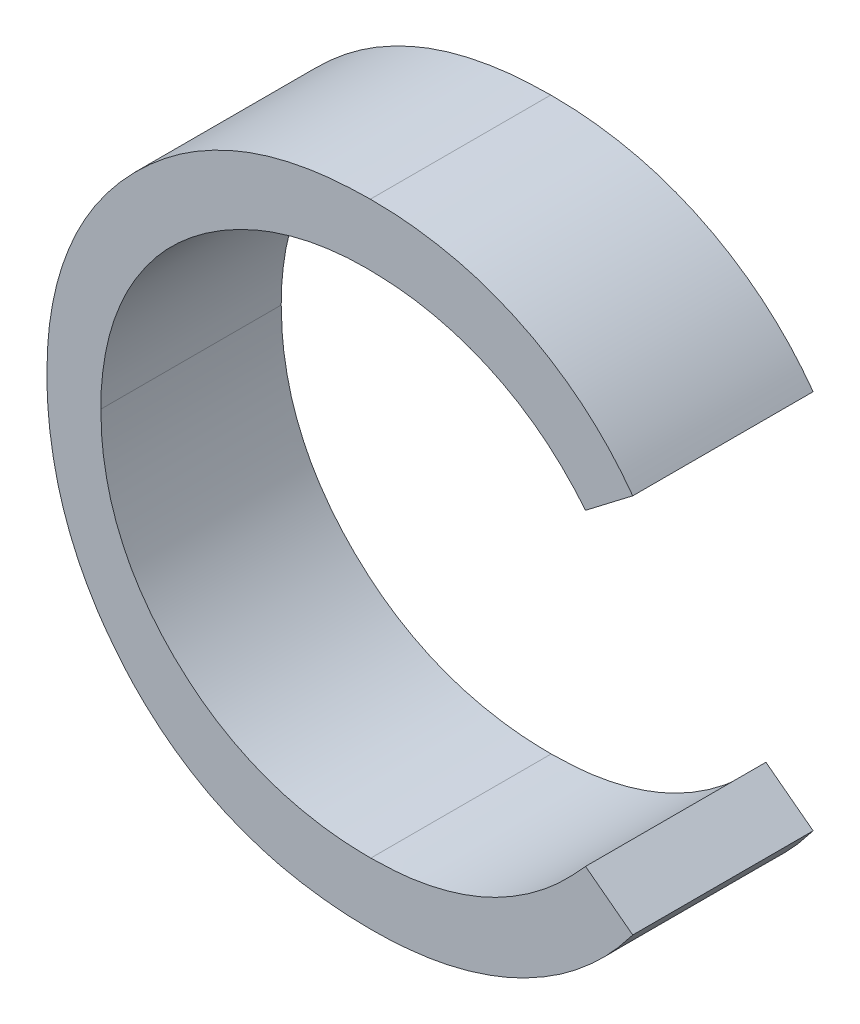
ISO-10303-21;
HEADER;
FILE_DESCRIPTION(('STEP AP214'),'2;1');
FILE_NAME('part.step','',(''),(''),'','','');
FILE_SCHEMA(('AUTOMOTIVE_DESIGN { 1 0 10303 214 1 1 1 1 }'));
ENDSEC;
DATA;
#1=APPLICATION_CONTEXT('core data for automotive mechanical design processes');
#2=APPLICATION_PROTOCOL_DEFINITION('international standard','automotive_design',2000,#1);
#3=PRODUCT_CONTEXT('',#1,'mechanical');
#4=PRODUCT('Part','Part','',(#3));
#5=PRODUCT_RELATED_PRODUCT_CATEGORY('part','',(#4));
#6=PRODUCT_DEFINITION_FORMATION('','',#4);
#7=PRODUCT_DEFINITION_CONTEXT('part definition',#1,'design');
#8=PRODUCT_DEFINITION('design','',#6,#7);
#9=PRODUCT_DEFINITION_SHAPE('','',#8);
#10=(LENGTH_UNIT() NAMED_UNIT(*) SI_UNIT(.MILLI.,.METRE.));
#11=(NAMED_UNIT(*) PLANE_ANGLE_UNIT() SI_UNIT($,.RADIAN.));
#12=(NAMED_UNIT(*) SI_UNIT($,.STERADIAN.) SOLID_ANGLE_UNIT());
#13=UNCERTAINTY_MEASURE_WITH_UNIT(LENGTH_MEASURE(1.E-05),#10,'distance_accuracy_value','');
#14=(GEOMETRIC_REPRESENTATION_CONTEXT(3) GLOBAL_UNCERTAINTY_ASSIGNED_CONTEXT((#13)) GLOBAL_UNIT_ASSIGNED_CONTEXT((#10,
#11,#12)) REPRESENTATION_CONTEXT('',''));
#15=CARTESIAN_POINT('',(0.,0.,0.));
#16=DIRECTION('',(0.,0.,1.));
#17=DIRECTION('',(1.,0.,0.));
#18=AXIS2_PLACEMENT_3D('',#15,#16,#17);
#19=CARTESIAN_POINT('',(-52.9985710951003,-17.7419139480257,1.5));
#20=CARTESIAN_POINT('',(-52.9411218494626,-17.7426027168698,1.5));
#21=CARTESIAN_POINT('',(-52.8274068533271,-17.7439660654321,1.5));
#22=CARTESIAN_POINT('',(-52.6591887784523,-17.7572605541673,1.5));
#23=CARTESIAN_POINT('',(-52.4954140256763,-17.7794228487774,1.5));
#24=CARTESIAN_POINT('',(-52.3359697656272,-17.8095886627962,1.5));
#25=CARTESIAN_POINT('',(-52.1800803139088,-17.847027693467,1.5));
#26=CARTESIAN_POINT('',(-52.0289371126537,-17.895799548205,1.5));
#27=CARTESIAN_POINT('',(-51.8816532742757,-17.951566021513,1.5));
#28=CARTESIAN_POINT('',(-51.7391576911665,-18.0157924014243,1.5));
#29=CARTESIAN_POINT('',(-51.6021340481089,-18.0878877462912,1.5));
#30=CARTESIAN_POINT('',(-51.4706250216642,-18.1670529227859,1.5));
#31=CARTESIAN_POINT('',(-51.3456752235104,-18.2531897877922,1.5));
#32=CARTESIAN_POINT('',(-51.2264054400296,-18.3455657526631,1.5));
#33=CARTESIAN_POINT('',(-51.1148108527781,-18.4461351230852,1.5));
#34=CARTESIAN_POINT('',(-51.0077230262993,-18.5521316887618,1.5));
#35=CARTESIAN_POINT('',(-50.9087786289255,-18.6666085804152,1.5));
#36=CARTESIAN_POINT('',(-50.8477026360768,-18.7471870574279,1.5));
#37=CARTESIAN_POINT('',(-50.8170807104849,-18.7875870249488,1.5));
#38=B_SPLINE_CURVE_WITH_KNOTS('',3,(#19,#20,#21,#22,#23,#24,#25,#26,#27,#28,#29,#30,#31,#32,#33,
#34,#35,#36,#37),.UNSPECIFIED.,.F.,.F.,(4,1,1,1,1,1,1,1,1,1,1,1,1,1,1,1,4),(0.,
0.0685475367089007,0.135682945623048,0.201214989526329,0.265682234754696,0.329266834817258,
0.392395427844327,0.455069761652144,0.517126850064504,0.578790035286652,0.639739863343541,
0.700191503666307,0.75980624259667,0.819628319275009,0.879354791046277,0.939511607764661,1.),.UNSPECIFIED.);
#39=DIRECTION('',(0.,0.,-1.));
#40=VECTOR('',#39,1.);
#41=SURFACE_OF_LINEAR_EXTRUSION('',#38,#40);
#42=CARTESIAN_POINT('',(-52.9985710951003,-17.7419139480257,0.));
#43=CARTESIAN_POINT('',(-52.9411218494626,-17.7426027168698,0.));
#44=CARTESIAN_POINT('',(-52.8274068533271,-17.7439660654321,0.));
#45=CARTESIAN_POINT('',(-52.6591887784523,-17.7572605541673,0.));
#46=CARTESIAN_POINT('',(-52.4954140256763,-17.7794228487774,0.));
#47=CARTESIAN_POINT('',(-52.3359697656272,-17.8095886627962,0.));
#48=CARTESIAN_POINT('',(-52.1800803139088,-17.847027693467,0.));
#49=CARTESIAN_POINT('',(-52.0289371126537,-17.895799548205,0.));
#50=CARTESIAN_POINT('',(-51.8816532742757,-17.951566021513,0.));
#51=CARTESIAN_POINT('',(-51.7391576911665,-18.0157924014243,0.));
#52=CARTESIAN_POINT('',(-51.6021340481089,-18.0878877462912,0.));
#53=CARTESIAN_POINT('',(-51.4706250216642,-18.1670529227859,0.));
#54=CARTESIAN_POINT('',(-51.3456752235104,-18.2531897877922,0.));
#55=CARTESIAN_POINT('',(-51.2264054400296,-18.3455657526631,0.));
#56=CARTESIAN_POINT('',(-51.1148108527781,-18.4461351230852,0.));
#57=CARTESIAN_POINT('',(-51.0077230262993,-18.5521316887618,0.));
#58=CARTESIAN_POINT('',(-50.9087786289255,-18.6666085804152,0.));
#59=CARTESIAN_POINT('',(-50.8477026360768,-18.7471870574279,0.));
#60=CARTESIAN_POINT('',(-50.8170807104849,-18.7875870249488,0.));
#61=B_SPLINE_CURVE_WITH_KNOTS('',3,(#42,#43,#44,#45,#46,#47,#48,#49,#50,#51,#52,#53,#54,#55,#56,
#57,#58,#59,#60),.UNSPECIFIED.,.F.,.F.,(4,1,1,1,1,1,1,1,1,1,1,1,1,1,1,1,4),(0.,
0.0685475367089007,0.135682945623048,0.201214989526329,0.265682234754696,0.329266834817258,
0.392395427844327,0.455069761652144,0.517126850064504,0.578790035286652,0.639739863343541,
0.700191503666307,0.75980624259667,0.819628319275009,0.879354791046277,0.939511607764661,1.),.UNSPECIFIED.);
#62=CARTESIAN_POINT('',(-52.9985710951003,-17.7419139480257,0.));
#63=VERTEX_POINT('',#62);
#64=CARTESIAN_POINT('',(-50.8170807104849,-18.7875870249488,0.));
#65=VERTEX_POINT('',#64);
#66=EDGE_CURVE('E223',#63,#65,#61,.T.);
#67=ORIENTED_EDGE('',*,*,#66,.F.);
#68=DIRECTION('',(0.,0.,-1.));
#69=VECTOR('',#68,1.);
#70=CARTESIAN_POINT('',(-52.9985710951003,-17.7419139480257,1.5));
#71=LINE('',#70,#69);
#72=CARTESIAN_POINT('',(-52.9985710951003,-17.7419139480257,1.5));
#73=VERTEX_POINT('',#72);
#74=EDGE_CURVE('E11',#73,#63,#71,.T.);
#75=ORIENTED_EDGE('',*,*,#74,.F.);
#76=CARTESIAN_POINT('',(-50.8170807104849,-18.7875870249488,1.5));
#77=VERTEX_POINT('',#76);
#78=EDGE_CURVE('E251',#73,#77,#38,.T.);
#79=ORIENTED_EDGE('',*,*,#78,.T.);
#80=DIRECTION('',(0.,0.,-1.));
#81=VECTOR('',#80,1.);
#82=CARTESIAN_POINT('',(-50.8170807104849,-18.7875870249488,1.5));
#83=LINE('',#82,#81);
#84=EDGE_CURVE('E37',#77,#65,#83,.T.);
#85=ORIENTED_EDGE('',*,*,#84,.T.);
#86=EDGE_LOOP('',(#67,#75,#79,#85));
#87=FACE_BOUND('',#86,.T.);
#88=ADVANCED_FACE('F33',(#87),#41,.T.);
#89=CARTESIAN_POINT('',(-55.6888755822798,-20.3410726018718,1.5));
#90=CARTESIAN_POINT('',(-55.6866538771983,-20.25113623967,1.5));
#91=CARTESIAN_POINT('',(-55.6822828111504,-20.0741920617241,1.5));
#92=CARTESIAN_POINT('',(-55.6451459604765,-19.8145149855968,1.5));
#93=CARTESIAN_POINT('',(-55.5854048230601,-19.5657272729493,1.5));
#94=CARTESIAN_POINT('',(-55.5005521250672,-19.3282933521095,1.5));
#95=CARTESIAN_POINT('',(-55.3929730517738,-19.1009643803494,1.5));
#96=CARTESIAN_POINT('',(-55.2600778891459,-18.885476944854,1.5));
#97=CARTESIAN_POINT('',(-55.1034105431153,-18.6804529453447,1.5));
#98=CARTESIAN_POINT('',(-54.9241997321388,-18.4890033006339,1.5));
#99=CARTESIAN_POINT('',(-54.7276749674248,-18.3139470826021,1.5));
#100=CARTESIAN_POINT('',(-54.517219519012,-18.1599382201045,1.5));
#101=CARTESIAN_POINT('',(-54.293245309051,-18.0317703401058,1.5));
#102=CARTESIAN_POINT('',(-54.0582198066573,-17.9246329652114,1.5));
#103=CARTESIAN_POINT('',(-53.810383118705,-17.8422837321602,1.5));
#104=CARTESIAN_POINT('',(-53.5502640199544,-17.784636322606,1.5));
#105=CARTESIAN_POINT('',(-53.2783512845526,-17.7487547279061,1.5));
#106=CARTESIAN_POINT('',(-53.092833533625,-17.7442187166163,1.5));
#107=CARTESIAN_POINT('',(-52.9985710951003,-17.7419139480257,1.5));
#108=B_SPLINE_CURVE_WITH_KNOTS('',3,(#89,#90,#91,#92,#93,#94,#95,#96,#97,#98,#99,#100,#101,#102,
#103,#104,#105,#106,#107),.UNSPECIFIED.,.F.,.F.,(4,1,1,1,1,1,1,1,1,1,1,1,1,1,1,1,4),(0.,
0.0645578459297186,0.127013531549758,0.18795481020209,0.248013912789634,0.307747681848837,
0.368234514697485,0.42946984394267,0.492743436746585,0.556257768706083,0.618216785543143,
0.679655475587554,0.741245545620629,0.803415264705696,0.866815461543992,0.932328311949265,1.),.UNSPECIFIED.);
#109=DIRECTION('',(0.,0.,-1.));
#110=VECTOR('',#109,1.);
#111=SURFACE_OF_LINEAR_EXTRUSION('',#108,#110);
#112=CARTESIAN_POINT('',(-55.6888755822798,-20.3410726018718,0.));
#113=CARTESIAN_POINT('',(-55.6866538771983,-20.25113623967,0.));
#114=CARTESIAN_POINT('',(-55.6822828111504,-20.0741920617241,0.));
#115=CARTESIAN_POINT('',(-55.6451459604765,-19.8145149855968,0.));
#116=CARTESIAN_POINT('',(-55.5854048230601,-19.5657272729493,0.));
#117=CARTESIAN_POINT('',(-55.5005521250672,-19.3282933521095,0.));
#118=CARTESIAN_POINT('',(-55.3929730517738,-19.1009643803494,0.));
#119=CARTESIAN_POINT('',(-55.2600778891459,-18.885476944854,0.));
#120=CARTESIAN_POINT('',(-55.1034105431153,-18.6804529453447,0.));
#121=CARTESIAN_POINT('',(-54.9241997321388,-18.4890033006339,0.));
#122=CARTESIAN_POINT('',(-54.7276749674248,-18.3139470826021,0.));
#123=CARTESIAN_POINT('',(-54.517219519012,-18.1599382201045,0.));
#124=CARTESIAN_POINT('',(-54.293245309051,-18.0317703401058,0.));
#125=CARTESIAN_POINT('',(-54.0582198066573,-17.9246329652114,0.));
#126=CARTESIAN_POINT('',(-53.810383118705,-17.8422837321602,0.));
#127=CARTESIAN_POINT('',(-53.5502640199544,-17.784636322606,0.));
#128=CARTESIAN_POINT('',(-53.2783512845526,-17.7487547279061,0.));
#129=CARTESIAN_POINT('',(-53.092833533625,-17.7442187166163,0.));
#130=CARTESIAN_POINT('',(-52.9985710951003,-17.7419139480257,0.));
#131=B_SPLINE_CURVE_WITH_KNOTS('',3,(#112,#113,#114,#115,#116,#117,#118,#119,#120,#121,#122,
#123,#124,#125,#126,#127,#128,#129,#130),.UNSPECIFIED.,.F.,.F.,(4,1,1,1,1,1,1,1,1,1,1,1,1,1,1,1,
4),(0.,0.0645578459297186,0.127013531549758,0.18795481020209,0.248013912789634,
0.307747681848837,0.368234514697485,0.42946984394267,0.492743436746585,0.556257768706083,
0.618216785543143,0.679655475587554,0.741245545620629,0.803415264705696,0.866815461543992,
0.932328311949265,1.),.UNSPECIFIED.);
#132=CARTESIAN_POINT('',(-55.6888755822798,-20.3410726018718,0.));
#133=VERTEX_POINT('',#132);
#134=EDGE_CURVE('E250',#133,#63,#131,.T.);
#135=ORIENTED_EDGE('',*,*,#134,.F.);
#136=DIRECTION('',(0.,0.,-1.));
#137=VECTOR('',#136,1.);
#138=CARTESIAN_POINT('',(-55.6888755822798,-20.3410726018718,1.5));
#139=LINE('',#138,#137);
#140=CARTESIAN_POINT('',(-55.6888755822798,-20.3410726018718,1.5));
#141=VERTEX_POINT('',#140);
#142=EDGE_CURVE('E43',#141,#133,#139,.T.);
#143=ORIENTED_EDGE('',*,*,#142,.F.);
#144=EDGE_CURVE('E139',#141,#73,#108,.T.);
#145=ORIENTED_EDGE('',*,*,#144,.T.);
#146=ORIENTED_EDGE('',*,*,#74,.T.);
#147=EDGE_LOOP('',(#135,#143,#145,#146));
#148=FACE_BOUND('',#147,.T.);
#149=ADVANCED_FACE('F230',(#148),#111,.T.);
#150=CARTESIAN_POINT('',(-55.0548611592029,-22.1239251659744,1.5));
#151=CARTESIAN_POINT('',(-55.1054835070597,-22.0617234675214,1.5));
#152=CARTESIAN_POINT('',(-55.2061170453851,-21.9380710240812,1.5));
#153=CARTESIAN_POINT('',(-55.3348680218868,-21.7376624794263,1.5));
#154=CARTESIAN_POINT('',(-55.4450788150429,-21.5284221810323,1.5));
#155=CARTESIAN_POINT('',(-55.5341872732974,-21.3092508542061,1.5));
#156=CARTESIAN_POINT('',(-55.6038483206612,-21.0806403010054,1.5));
#157=CARTESIAN_POINT('',(-55.6521071707751,-20.8424752804187,1.5));
#158=CARTESIAN_POINT('',(-55.6834666057434,-20.5949782201299,1.5));
#159=CARTESIAN_POINT('',(-55.6870527325736,-20.4266399506157,1.5));
#160=CARTESIAN_POINT('',(-55.6888755822798,-20.3410726018718,1.5));
#161=B_SPLINE_CURVE_WITH_KNOTS('',3,(#150,#151,#152,#153,#154,#155,#156,#157,#158,#159,#160),
.UNSPECIFIED.,.F.,.F.,(4,1,1,1,1,1,1,1,4),(0.,0.124328509593849,0.247156016361188,
0.368779749291339,0.490733862401648,0.613613771847844,0.738957575722216,0.867310575191261,1.),.UNSPECIFIED.);
#162=DIRECTION('',(0.,0.,-1.));
#163=VECTOR('',#162,1.);
#164=SURFACE_OF_LINEAR_EXTRUSION('',#161,#163);
#165=CARTESIAN_POINT('',(-55.0548611592029,-22.1239251659744,0.));
#166=CARTESIAN_POINT('',(-55.1054835070597,-22.0617234675214,0.));
#167=CARTESIAN_POINT('',(-55.2061170453851,-21.9380710240812,0.));
#168=CARTESIAN_POINT('',(-55.3348680218868,-21.7376624794263,0.));
#169=CARTESIAN_POINT('',(-55.4450788150429,-21.5284221810323,0.));
#170=CARTESIAN_POINT('',(-55.5341872732974,-21.3092508542061,0.));
#171=CARTESIAN_POINT('',(-55.6038483206612,-21.0806403010054,0.));
#172=CARTESIAN_POINT('',(-55.6521071707751,-20.8424752804187,0.));
#173=CARTESIAN_POINT('',(-55.6834666057434,-20.5949782201299,0.));
#174=CARTESIAN_POINT('',(-55.6870527325736,-20.4266399506157,0.));
#175=CARTESIAN_POINT('',(-55.6888755822798,-20.3410726018718,0.));
#176=B_SPLINE_CURVE_WITH_KNOTS('',3,(#165,#166,#167,#168,#169,#170,#171,#172,#173,#174,#175),
.UNSPECIFIED.,.F.,.F.,(4,1,1,1,1,1,1,1,4),(0.,0.124328509593849,0.247156016361188,
0.368779749291339,0.490733862401648,0.613613771847844,0.738957575722216,0.867310575191261,1.),.UNSPECIFIED.);
#177=CARTESIAN_POINT('',(-55.0548611592029,-22.1239251659744,0.));
#178=VERTEX_POINT('',#177);
#179=EDGE_CURVE('E126',#178,#133,#176,.T.);
#180=ORIENTED_EDGE('',*,*,#179,.F.);
#181=DIRECTION('',(0.,0.,-1.));
#182=VECTOR('',#181,1.);
#183=CARTESIAN_POINT('',(-55.0548611592029,-22.1239251659744,1.5));
#184=LINE('',#183,#182);
#185=CARTESIAN_POINT('',(-55.0548611592029,-22.1239251659744,1.5));
#186=VERTEX_POINT('',#185);
#187=EDGE_CURVE('E121',#186,#178,#184,.T.);
#188=ORIENTED_EDGE('',*,*,#187,.F.);
#189=EDGE_CURVE('E124',#186,#141,#161,.T.);
#190=ORIENTED_EDGE('',*,*,#189,.T.);
#191=ORIENTED_EDGE('',*,*,#142,.T.);
#192=EDGE_LOOP('',(#180,#188,#190,#191));
#193=FACE_BOUND('',#192,.T.);
#194=ADVANCED_FACE('F123',(#193),#164,.T.);
#195=CARTESIAN_POINT('',(-52.9925614797157,-22.998324204436,1.5));
#196=CARTESIAN_POINT('',(-53.046338146941,-22.9979499293562,1.5));
#197=CARTESIAN_POINT('',(-53.1526748470792,-22.9972098467336,1.5));
#198=CARTESIAN_POINT('',(-53.309673063668,-22.9852210361465,1.5));
#199=CARTESIAN_POINT('',(-53.462515321956,-22.9688642691322,1.5));
#200=CARTESIAN_POINT('',(-53.6107647874799,-22.9442355104694,1.5));
#201=CARTESIAN_POINT('',(-53.7552304661176,-22.9151721675353,1.5));
#202=CARTESIAN_POINT('',(-53.894602729676,-22.8762132294992,1.5));
#203=CARTESIAN_POINT('',(-54.0302530301881,-22.8325715629333,1.5));
#204=CARTESIAN_POINT('',(-54.1616363740397,-22.7812787247266,1.5));
#205=CARTESIAN_POINT('',(-54.2888645166063,-22.7233984639589,1.5));
#206=CARTESIAN_POINT('',(-54.4115271042747,-22.657981951243,1.5));
#207=CARTESIAN_POINT('',(-54.5295677219875,-22.5855792874412,1.5));
#208=CARTESIAN_POINT('',(-54.6441468946379,-22.5077864154074,1.5));
#209=CARTESIAN_POINT('',(-54.7535720141737,-22.4221045555925,1.5));
#210=CARTESIAN_POINT('',(-54.8587913360985,-22.3297236491587,1.5));
#211=CARTESIAN_POINT('',(-54.9603948735737,-22.230955062371,1.5));
#212=CARTESIAN_POINT('',(-55.0232558521333,-22.1597338433105,1.5));
#213=CARTESIAN_POINT('',(-55.0548611592029,-22.1239251659744,1.5));
#214=B_SPLINE_CURVE_WITH_KNOTS('',3,(#195,#196,#197,#198,#199,#200,#201,#202,#203,#204,#205,
#206,#207,#208,#209,#210,#211,#212,#213),.UNSPECIFIED.,.F.,.F.,(4,1,1,1,1,1,1,1,1,1,1,1,1,1,1,1,
4),(0.,0.0696628008990774,0.137749562258272,0.203916743517782,0.268779862329338,
0.332413706477223,0.394753540447138,0.456180031659169,0.51699564919672,0.577395937965951,
0.637198343509275,0.696999184261453,0.75675619422556,0.816553905272607,0.876947996597871,
0.938131787920596,1.),.UNSPECIFIED.);
#215=DIRECTION('',(0.,0.,-1.));
#216=VECTOR('',#215,1.);
#217=SURFACE_OF_LINEAR_EXTRUSION('',#214,#216);
#218=CARTESIAN_POINT('',(-52.9925614797157,-22.998324204436,0.));
#219=CARTESIAN_POINT('',(-53.046338146941,-22.9979499293562,0.));
#220=CARTESIAN_POINT('',(-53.1526748470792,-22.9972098467336,0.));
#221=CARTESIAN_POINT('',(-53.309673063668,-22.9852210361465,0.));
#222=CARTESIAN_POINT('',(-53.462515321956,-22.9688642691322,0.));
#223=CARTESIAN_POINT('',(-53.6107647874799,-22.9442355104694,0.));
#224=CARTESIAN_POINT('',(-53.7552304661176,-22.9151721675353,0.));
#225=CARTESIAN_POINT('',(-53.894602729676,-22.8762132294992,0.));
#226=CARTESIAN_POINT('',(-54.0302530301881,-22.8325715629333,0.));
#227=CARTESIAN_POINT('',(-54.1616363740397,-22.7812787247266,0.));
#228=CARTESIAN_POINT('',(-54.2888645166063,-22.7233984639589,0.));
#229=CARTESIAN_POINT('',(-54.4115271042747,-22.657981951243,0.));
#230=CARTESIAN_POINT('',(-54.5295677219875,-22.5855792874412,0.));
#231=CARTESIAN_POINT('',(-54.6441468946379,-22.5077864154074,0.));
#232=CARTESIAN_POINT('',(-54.7535720141737,-22.4221045555925,0.));
#233=CARTESIAN_POINT('',(-54.8587913360985,-22.3297236491587,0.));
#234=CARTESIAN_POINT('',(-54.9603948735737,-22.230955062371,0.));
#235=CARTESIAN_POINT('',(-55.0232558521333,-22.1597338433105,0.));
#236=CARTESIAN_POINT('',(-55.0548611592029,-22.1239251659744,0.));
#237=B_SPLINE_CURVE_WITH_KNOTS('',3,(#218,#219,#220,#221,#222,#223,#224,#225,#226,#227,#228,
#229,#230,#231,#232,#233,#234,#235,#236),.UNSPECIFIED.,.F.,.F.,(4,1,1,1,1,1,1,1,1,1,1,1,1,1,1,1,
4),(0.,0.0696628008990774,0.137749562258272,0.203916743517782,0.268779862329338,
0.332413706477223,0.394753540447138,0.456180031659169,0.51699564919672,0.577395937965951,
0.637198343509275,0.696999184261453,0.75675619422556,0.816553905272607,0.876947996597871,
0.938131787920596,1.),.UNSPECIFIED.);
#238=CARTESIAN_POINT('',(-52.9925614797157,-22.998324204436,0.));
#239=VERTEX_POINT('',#238);
#240=EDGE_CURVE('E254',#239,#178,#237,.T.);
#241=ORIENTED_EDGE('',*,*,#240,.F.);
#242=DIRECTION('',(0.,0.,-1.));
#243=VECTOR('',#242,1.);
#244=CARTESIAN_POINT('',(-52.9925614797157,-22.998324204436,1.5));
#245=LINE('',#244,#243);
#246=CARTESIAN_POINT('',(-52.9925614797157,-22.998324204436,1.5));
#247=VERTEX_POINT('',#246);
#248=EDGE_CURVE('E131',#247,#239,#245,.T.);
#249=ORIENTED_EDGE('',*,*,#248,.F.);
#250=EDGE_CURVE('E137',#247,#186,#214,.T.);
#251=ORIENTED_EDGE('',*,*,#250,.T.);
#252=ORIENTED_EDGE('',*,*,#187,.T.);
#253=EDGE_LOOP('',(#241,#249,#251,#252));
#254=FACE_BOUND('',#253,.T.);
#255=ADVANCED_FACE('F141',(#254),#217,.T.);
#256=CARTESIAN_POINT('',(-50.8170807104849,-21.9496463198206,1.5));
#257=CARTESIAN_POINT('',(-50.8486780103151,-21.9904155368539,1.5));
#258=CARTESIAN_POINT('',(-50.9117212606943,-22.0717586886741,1.5));
#259=CARTESIAN_POINT('',(-51.0138041421034,-22.1864325597084,1.5));
#260=CARTESIAN_POINT('',(-51.121343138383,-22.2942954675643,1.5));
#261=CARTESIAN_POINT('',(-51.2351370098214,-22.3944777836036,1.5));
#262=CARTESIAN_POINT('',(-51.3538767120924,-22.4889841630391,1.5));
#263=CARTESIAN_POINT('',(-51.4796943011561,-22.5751296362901,1.5));
#264=CARTESIAN_POINT('',(-51.6109357761637,-22.6541166138363,1.5));
#265=CARTESIAN_POINT('',(-51.7471564603145,-22.7264407917108,1.5));
#266=CARTESIAN_POINT('',(-51.8882116214569,-22.79060828746,1.5));
#267=CARTESIAN_POINT('',(-52.0339322428026,-22.8455422414486,1.5));
#268=CARTESIAN_POINT('',(-52.1836902078083,-22.8928635122094,1.5));
#269=CARTESIAN_POINT('',(-52.3374923626827,-22.9317948503863,1.5));
#270=CARTESIAN_POINT('',(-52.4956577295783,-22.9621821130627,1.5));
#271=CARTESIAN_POINT('',(-52.6576155497115,-22.9824959342695,1.5));
#272=CARTESIAN_POINT('',(-52.8237153714529,-22.9964129548907,1.5));
#273=CARTESIAN_POINT('',(-52.9357745444897,-22.9976814060603,1.5));
#274=CARTESIAN_POINT('',(-52.9925614797157,-22.998324204436,1.5));
#275=B_SPLINE_CURVE_WITH_KNOTS('',3,(#256,#257,#258,#259,#260,#261,#262,#263,#264,#265,#266,
#267,#268,#269,#270,#271,#272,#273,#274),.UNSPECIFIED.,.F.,.F.,(4,1,1,1,1,1,1,1,1,1,1,1,1,1,1,1,
4),(0.,0.0616742388774252,0.123053061634805,0.183475000731703,0.243726500510611,
0.304278916512255,0.364862920960682,0.425946203968619,0.487391229965409,0.549220384075477,
0.611143588692602,0.673528530310151,0.736961456657304,0.800785282872839,0.866012595641614,
0.932100747790579,1.),.UNSPECIFIED.);
#276=DIRECTION('',(0.,0.,-1.));
#277=VECTOR('',#276,1.);
#278=SURFACE_OF_LINEAR_EXTRUSION('',#275,#277);
#279=CARTESIAN_POINT('',(-50.8170807104849,-21.9496463198206,0.));
#280=CARTESIAN_POINT('',(-50.8486780103151,-21.9904155368539,0.));
#281=CARTESIAN_POINT('',(-50.9117212606943,-22.0717586886741,0.));
#282=CARTESIAN_POINT('',(-51.0138041421034,-22.1864325597084,0.));
#283=CARTESIAN_POINT('',(-51.121343138383,-22.2942954675643,0.));
#284=CARTESIAN_POINT('',(-51.2351370098214,-22.3944777836036,0.));
#285=CARTESIAN_POINT('',(-51.3538767120924,-22.4889841630391,0.));
#286=CARTESIAN_POINT('',(-51.4796943011561,-22.5751296362901,0.));
#287=CARTESIAN_POINT('',(-51.6109357761637,-22.6541166138363,0.));
#288=CARTESIAN_POINT('',(-51.7471564603145,-22.7264407917108,0.));
#289=CARTESIAN_POINT('',(-51.8882116214569,-22.79060828746,0.));
#290=CARTESIAN_POINT('',(-52.0339322428026,-22.8455422414486,0.));
#291=CARTESIAN_POINT('',(-52.1836902078083,-22.8928635122094,0.));
#292=CARTESIAN_POINT('',(-52.3374923626827,-22.9317948503863,0.));
#293=CARTESIAN_POINT('',(-52.4956577295783,-22.9621821130627,0.));
#294=CARTESIAN_POINT('',(-52.6576155497115,-22.9824959342695,0.));
#295=CARTESIAN_POINT('',(-52.8237153714529,-22.9964129548907,0.));
#296=CARTESIAN_POINT('',(-52.9357745444897,-22.9976814060603,0.));
#297=CARTESIAN_POINT('',(-52.9925614797157,-22.998324204436,0.));
#298=B_SPLINE_CURVE_WITH_KNOTS('',3,(#279,#280,#281,#282,#283,#284,#285,#286,#287,#288,#289,
#290,#291,#292,#293,#294,#295,#296,#297),.UNSPECIFIED.,.F.,.F.,(4,1,1,1,1,1,1,1,1,1,1,1,1,1,1,1,
4),(0.,0.0616742388774252,0.123053061634805,0.183475000731703,0.243726500510611,
0.304278916512255,0.364862920960682,0.425946203968619,0.487391229965409,0.549220384075477,
0.611143588692602,0.673528530310151,0.736961456657304,0.800785282872839,0.866012595641614,
0.932100747790579,1.),.UNSPECIFIED.);
#299=CARTESIAN_POINT('',(-50.8170807104849,-21.9496463198206,0.));
#300=VERTEX_POINT('',#299);
#301=EDGE_CURVE('E267',#300,#239,#298,.T.);
#302=ORIENTED_EDGE('',*,*,#301,.F.);
#303=DIRECTION('',(0.,0.,-1.));
#304=VECTOR('',#303,1.);
#305=CARTESIAN_POINT('',(-50.8170807104849,-21.9496463198206,1.5));
#306=LINE('',#305,#304);
#307=CARTESIAN_POINT('',(-50.8170807104849,-21.9496463198206,1.5));
#308=VERTEX_POINT('',#307);
#309=EDGE_CURVE('E197',#308,#300,#306,.T.);
#310=ORIENTED_EDGE('',*,*,#309,.F.);
#311=EDGE_CURVE('E142',#308,#247,#275,.T.);
#312=ORIENTED_EDGE('',*,*,#311,.T.);
#313=ORIENTED_EDGE('',*,*,#248,.T.);
#314=EDGE_LOOP('',(#302,#310,#312,#313));
#315=FACE_BOUND('',#314,.T.);
#316=ADVANCED_FACE('F164',(#315),#278,.T.);
#317=CARTESIAN_POINT('',(-51.2097089156131,-21.6521703582821,1.5));
#318=DIRECTION('',(0.603896835253378,0.797062489627353,0.));
#319=DIRECTION('',(-0.797062489627353,0.603896835253378,0.));
#320=AXIS2_PLACEMENT_3D('',#317,#318,#319);
#321=PLANE('',#320);
#322=DIRECTION('',(0.797062489627353,-0.603896835253378,0.));
#323=VECTOR('',#322,1.);
#324=CARTESIAN_POINT('',(-51.2097089156131,-21.6521703582821,0.));
#325=LINE('',#324,#323);
#326=CARTESIAN_POINT('',(-51.2097089156131,-21.6521703582821,0.));
#327=VERTEX_POINT('',#326);
#328=EDGE_CURVE('E269',#327,#300,#325,.T.);
#329=ORIENTED_EDGE('',*,*,#328,.F.);
#330=DIRECTION('',(0.,0.,-1.));
#331=VECTOR('',#330,1.);
#332=CARTESIAN_POINT('',(-51.2097089156131,-21.6521703582821,1.5));
#333=LINE('',#332,#331);
#334=CARTESIAN_POINT('',(-51.2097089156131,-21.6521703582821,1.5));
#335=VERTEX_POINT('',#334);
#336=EDGE_CURVE('E199',#335,#327,#333,.T.);
#337=ORIENTED_EDGE('',*,*,#336,.F.);
#338=DIRECTION('',(0.797062489627353,-0.603896835253378,0.));
#339=VECTOR('',#338,1.);
#340=CARTESIAN_POINT('',(-51.2097089156131,-21.6521703582821,1.5));
#341=LINE('',#340,#339);
#342=EDGE_CURVE('E144',#335,#308,#341,.T.);
#343=ORIENTED_EDGE('',*,*,#342,.T.);
#344=ORIENTED_EDGE('',*,*,#309,.T.);
#345=EDGE_LOOP('',(#329,#337,#343,#344));
#346=FACE_BOUND('',#345,.T.);
#347=ADVANCED_FACE('F168',(#346),#321,.T.);
#348=CARTESIAN_POINT('',(-52.995566287408,-22.4855036916154,1.5));
#349=CARTESIAN_POINT('',(-52.9082767317029,-22.4830911491141,1.5));
#350=CARTESIAN_POINT('',(-52.7364700046744,-22.4783426883434,1.5));
#351=CARTESIAN_POINT('',(-52.4845156813297,-22.4381151895964,1.5));
#352=CARTESIAN_POINT('',(-52.2433217304314,-22.3728895926892,1.5));
#353=CARTESIAN_POINT('',(-52.0128751782294,-22.281606846519,1.5));
#354=CARTESIAN_POINT('',(-51.7938256836511,-22.1629421495151,1.5));
#355=CARTESIAN_POINT('',(-51.5858304546382,-22.0190880389331,1.5));
#356=CARTESIAN_POINT('',(-51.3887139253468,-21.8486761349893,1.5));
#357=CARTESIAN_POINT('',(-51.270183522152,-21.7185573803362,1.5));
#358=CARTESIAN_POINT('',(-51.2097089156131,-21.6521703582821,1.5));
#359=B_SPLINE_CURVE_WITH_KNOTS('',3,(#348,#349,#350,#351,#352,#353,#354,#355,#356,#357,#358),
.UNSPECIFIED.,.F.,.F.,(4,1,1,1,1,1,1,1,4),(0.,0.128515189511661,0.252948636352657,
0.374754734006006,0.495939753867051,0.617180641429892,0.740909469278138,0.867811148186202,1.),.UNSPECIFIED.);
#360=DIRECTION('',(0.,0.,-1.));
#361=VECTOR('',#360,1.);
#362=SURFACE_OF_LINEAR_EXTRUSION('',#359,#361);
#363=CARTESIAN_POINT('',(-52.995566287408,-22.4855036916154,0.));
#364=CARTESIAN_POINT('',(-52.9082767317029,-22.4830911491141,0.));
#365=CARTESIAN_POINT('',(-52.7364700046744,-22.4783426883434,0.));
#366=CARTESIAN_POINT('',(-52.4845156813297,-22.4381151895964,0.));
#367=CARTESIAN_POINT('',(-52.2433217304314,-22.3728895926892,0.));
#368=CARTESIAN_POINT('',(-52.0128751782294,-22.281606846519,0.));
#369=CARTESIAN_POINT('',(-51.7938256836511,-22.1629421495151,0.));
#370=CARTESIAN_POINT('',(-51.5858304546382,-22.0190880389331,0.));
#371=CARTESIAN_POINT('',(-51.3887139253468,-21.8486761349893,0.));
#372=CARTESIAN_POINT('',(-51.270183522152,-21.7185573803362,0.));
#373=CARTESIAN_POINT('',(-51.2097089156131,-21.6521703582821,0.));
#374=B_SPLINE_CURVE_WITH_KNOTS('',3,(#363,#364,#365,#366,#367,#368,#369,#370,#371,#372,#373),
.UNSPECIFIED.,.F.,.F.,(4,1,1,1,1,1,1,1,4),(0.,0.128515189511661,0.252948636352657,
0.374754734006006,0.495939753867051,0.617180641429892,0.740909469278138,0.867811148186202,1.),.UNSPECIFIED.);
#375=CARTESIAN_POINT('',(-52.995566287408,-22.4855036916154,0.));
#376=VERTEX_POINT('',#375);
#377=EDGE_CURVE('E206',#376,#327,#374,.T.);
#378=ORIENTED_EDGE('',*,*,#377,.F.);
#379=DIRECTION('',(0.,0.,-1.));
#380=VECTOR('',#379,1.);
#381=CARTESIAN_POINT('',(-52.995566287408,-22.4855036916154,1.5));
#382=LINE('',#381,#380);
#383=CARTESIAN_POINT('',(-52.995566287408,-22.4855036916154,1.5));
#384=VERTEX_POINT('',#383);
#385=EDGE_CURVE('E204',#384,#376,#382,.T.);
#386=ORIENTED_EDGE('',*,*,#385,.F.);
#387=EDGE_CURVE('E181',#384,#335,#359,.T.);
#388=ORIENTED_EDGE('',*,*,#387,.T.);
#389=ORIENTED_EDGE('',*,*,#336,.T.);
#390=EDGE_LOOP('',(#378,#386,#388,#389));
#391=FACE_BOUND('',#390,.T.);
#392=ADVANCED_FACE('F172',(#391),#362,.T.);
#393=CARTESIAN_POINT('',(-55.2401576335619,-20.3751270890513,1.5));
#394=CARTESIAN_POINT('',(-55.2383550349563,-20.4490289746552,1.5));
#395=CARTESIAN_POINT('',(-55.234815871697,-20.5941255244401,1.5));
#396=CARTESIAN_POINT('',(-55.2033182515821,-20.8066549680705,1.5));
#397=CARTESIAN_POINT('',(-55.1554538354555,-21.0102559306137,1.5));
#398=CARTESIAN_POINT('',(-55.0837172969759,-21.2036557053436,1.5));
#399=CARTESIAN_POINT('',(-54.9952615104609,-21.3892390739979,1.5));
#400=CARTESIAN_POINT('',(-54.8834892083105,-21.5638660074356,1.5));
#401=CARTESIAN_POINT('',(-54.7540370120759,-21.7301753853093,1.5));
#402=CARTESIAN_POINT('',(-54.6050735557029,-21.8842367392356,1.5));
#403=CARTESIAN_POINT('',(-54.4416366757183,-22.0249706325186,1.5));
#404=CARTESIAN_POINT('',(-54.2662825162984,-22.1489000346776,1.5));
#405=CARTESIAN_POINT('',(-54.0794478194639,-22.2522070096296,1.5));
#406=CARTESIAN_POINT('',(-53.8831954906259,-22.3381726475101,1.5));
#407=CARTESIAN_POINT('',(-53.6760153278851,-22.404253687018,1.5));
#408=CARTESIAN_POINT('',(-53.4582798958653,-22.4507738634512,1.5));
#409=CARTESIAN_POINT('',(-53.2304627597937,-22.4811198356535,1.5));
#410=CARTESIAN_POINT('',(-53.0747921885223,-22.4840251043237,1.5));
#411=CARTESIAN_POINT('',(-52.995566287408,-22.4855036916154,1.5));
#412=B_SPLINE_CURVE_WITH_KNOTS('',3,(#393,#394,#395,#396,#397,#398,#399,#400,#401,#402,#403,
#404,#405,#406,#407,#408,#409,#410,#411),.UNSPECIFIED.,.F.,.F.,(4,1,1,1,1,1,1,1,1,1,1,1,1,1,1,1,
4),(0.,0.0643232165798421,0.126290103703556,0.186726469216133,0.246146432335344,
0.30557564264614,0.365429385618053,0.42632630894826,0.488839906400641,0.551724971814048,
0.613918596466159,0.675483765768397,0.737333897099285,0.800229044394527,0.864502298123322,
0.931040739155698,1.),.UNSPECIFIED.);
#413=DIRECTION('',(0.,0.,-1.));
#414=VECTOR('',#413,1.);
#415=SURFACE_OF_LINEAR_EXTRUSION('',#412,#414);
#416=CARTESIAN_POINT('',(-55.2401576335619,-20.3751270890513,0.));
#417=CARTESIAN_POINT('',(-55.2383550349563,-20.4490289746552,0.));
#418=CARTESIAN_POINT('',(-55.234815871697,-20.5941255244401,0.));
#419=CARTESIAN_POINT('',(-55.2033182515821,-20.8066549680705,0.));
#420=CARTESIAN_POINT('',(-55.1554538354555,-21.0102559306137,0.));
#421=CARTESIAN_POINT('',(-55.0837172969759,-21.2036557053436,0.));
#422=CARTESIAN_POINT('',(-54.9952615104609,-21.3892390739979,0.));
#423=CARTESIAN_POINT('',(-54.8834892083105,-21.5638660074356,0.));
#424=CARTESIAN_POINT('',(-54.7540370120759,-21.7301753853093,0.));
#425=CARTESIAN_POINT('',(-54.6050735557029,-21.8842367392356,0.));
#426=CARTESIAN_POINT('',(-54.4416366757183,-22.0249706325186,0.));
#427=CARTESIAN_POINT('',(-54.2662825162984,-22.1489000346776,0.));
#428=CARTESIAN_POINT('',(-54.0794478194639,-22.2522070096296,0.));
#429=CARTESIAN_POINT('',(-53.8831954906259,-22.3381726475101,0.));
#430=CARTESIAN_POINT('',(-53.6760153278851,-22.404253687018,0.));
#431=CARTESIAN_POINT('',(-53.4582798958653,-22.4507738634512,0.));
#432=CARTESIAN_POINT('',(-53.2304627597937,-22.4811198356535,0.));
#433=CARTESIAN_POINT('',(-53.0747921885223,-22.4840251043237,0.));
#434=CARTESIAN_POINT('',(-52.995566287408,-22.4855036916154,0.));
#435=B_SPLINE_CURVE_WITH_KNOTS('',3,(#416,#417,#418,#419,#420,#421,#422,#423,#424,#425,#426,
#427,#428,#429,#430,#431,#432,#433,#434),.UNSPECIFIED.,.F.,.F.,(4,1,1,1,1,1,1,1,1,1,1,1,1,1,1,1,
4),(0.,0.0643232165798421,0.126290103703556,0.186726469216133,0.246146432335344,
0.30557564264614,0.365429385618053,0.42632630894826,0.488839906400641,0.551724971814048,
0.613918596466159,0.675483765768397,0.737333897099285,0.800229044394527,0.864502298123322,
0.931040739155698,1.),.UNSPECIFIED.);
#436=CARTESIAN_POINT('',(-55.2401576335619,-20.3751270890513,0.));
#437=VERTEX_POINT('',#436);
#438=EDGE_CURVE('E286',#437,#376,#435,.T.);
#439=ORIENTED_EDGE('',*,*,#438,.F.);
#440=DIRECTION('',(0.,0.,-1.));
#441=VECTOR('',#440,1.);
#442=CARTESIAN_POINT('',(-55.2401576335619,-20.3751270890513,1.5));
#443=LINE('',#442,#441);
#444=CARTESIAN_POINT('',(-55.2401576335619,-20.3751270890513,1.5));
#445=VERTEX_POINT('',#444);
#446=EDGE_CURVE('E210',#445,#437,#443,.T.);
#447=ORIENTED_EDGE('',*,*,#446,.F.);
#448=EDGE_CURVE('E186',#445,#384,#412,.T.);
#449=ORIENTED_EDGE('',*,*,#448,.T.);
#450=ORIENTED_EDGE('',*,*,#385,.T.);
#451=EDGE_LOOP('',(#439,#447,#449,#450));
#452=FACE_BOUND('',#451,.T.);
#453=ADVANCED_FACE('F177',(#452),#415,.T.);
#454=CARTESIAN_POINT('',(-53.0266159668952,-18.2547344608462,1.5));
#455=CARTESIAN_POINT('',(-53.0767349659529,-18.255311550146,1.5));
#456=CARTESIAN_POINT('',(-53.1765078124828,-18.2564603728125,1.5));
#457=CARTESIAN_POINT('',(-53.3245770603406,-18.2716162659624,1.5));
#458=CARTESIAN_POINT('',(-53.4698814190997,-18.2929179945975,1.5));
#459=CARTESIAN_POINT('',(-53.6123263708406,-18.3245255992024,1.5));
#460=CARTESIAN_POINT('',(-53.7517305973252,-18.3644864835988,1.5));
#461=CARTESIAN_POINT('',(-53.889005457419,-18.4122370749184,1.5));
#462=CARTESIAN_POINT('',(-54.0221634571292,-18.4713154175755,1.5));
#463=CARTESIAN_POINT('',(-54.1530466545781,-18.5366129317996,1.5));
#464=CARTESIAN_POINT('',(-54.2784455274285,-18.6103664242901,1.5));
#465=CARTESIAN_POINT('',(-54.3970955956818,-18.6908140698351,1.5));
#466=CARTESIAN_POINT('',(-54.5085641212835,-18.7770556361776,1.5));
#467=CARTESIAN_POINT('',(-54.6129392814738,-18.8694143595745,1.5));
#468=CARTESIAN_POINT('',(-54.7103277790959,-18.967474303111,1.5));
#469=CARTESIAN_POINT('',(-54.800023937389,-19.0722805053811,1.5));
#470=CARTESIAN_POINT('',(-54.8817173806253,-19.18349789612,1.5));
#471=CARTESIAN_POINT('',(-54.9570274164302,-19.2996599069177,1.5));
#472=CARTESIAN_POINT('',(-55.0244741783655,-19.4204281806818,1.5));
#473=CARTESIAN_POINT('',(-55.0809454346382,-19.5462497098796,1.5));
#474=CARTESIAN_POINT('',(-55.1309527520748,-19.6749698570669,1.5));
#475=CARTESIAN_POINT('',(-55.170523098712,-19.808042943965,1.5));
#476=CARTESIAN_POINT('',(-55.2018438370425,-19.9445326094554,1.5));
#477=CARTESIAN_POINT('',(-55.2234547845761,-20.0848051636696,1.5));
#478=CARTESIAN_POINT('',(-55.2384383148536,-20.2285675630943,1.5));
#479=CARTESIAN_POINT('',(-55.2395814247118,-20.3260094382577,1.5));
#480=CARTESIAN_POINT('',(-55.2401576335619,-20.3751270890513,1.5));
#481=B_SPLINE_CURVE_WITH_KNOTS('',3,(#454,#455,#456,#457,#458,#459,#460,#461,#462,#463,#464,
#465,#466,#467,#468,#469,#470,#471,#472,#473,#474,#475,#476,#477,#478,#479,#480),.UNSPECIFIED.,
.F.,.F.,(4,1,1,1,1,1,1,1,1,1,1,1,1,1,1,1,1,1,1,1,1,1,1,1,4),(0.,0.0439549089061942,
0.0875018747976039,0.130462626731491,0.172752020566518,0.215403067379603,0.257649829743239,
0.300152748957294,0.343121489502086,0.385925163206432,0.427685727402802,0.468817950486588,
0.509491800154994,0.549883031073349,0.589980022966886,0.63040523000684,0.670868626082638,
0.711383943838175,0.751627258063584,0.791775576865192,0.832458918803742,0.873319045017288,
0.914542955626349,0.956923558209884,1.),.UNSPECIFIED.);
#482=DIRECTION('',(0.,0.,-1.));
#483=VECTOR('',#482,1.);
#484=SURFACE_OF_LINEAR_EXTRUSION('',#481,#483);
#485=CARTESIAN_POINT('',(-53.0266159668952,-18.2547344608462,0.));
#486=CARTESIAN_POINT('',(-53.0767349659529,-18.255311550146,0.));
#487=CARTESIAN_POINT('',(-53.1765078124828,-18.2564603728125,0.));
#488=CARTESIAN_POINT('',(-53.3245770603406,-18.2716162659624,0.));
#489=CARTESIAN_POINT('',(-53.4698814190997,-18.2929179945975,0.));
#490=CARTESIAN_POINT('',(-53.6123263708406,-18.3245255992024,0.));
#491=CARTESIAN_POINT('',(-53.7517305973252,-18.3644864835988,0.));
#492=CARTESIAN_POINT('',(-53.889005457419,-18.4122370749184,0.));
#493=CARTESIAN_POINT('',(-54.0221634571292,-18.4713154175755,0.));
#494=CARTESIAN_POINT('',(-54.1530466545781,-18.5366129317996,0.));
#495=CARTESIAN_POINT('',(-54.2784455274285,-18.6103664242901,0.));
#496=CARTESIAN_POINT('',(-54.3970955956818,-18.6908140698351,0.));
#497=CARTESIAN_POINT('',(-54.5085641212835,-18.7770556361776,0.));
#498=CARTESIAN_POINT('',(-54.6129392814738,-18.8694143595745,0.));
#499=CARTESIAN_POINT('',(-54.7103277790959,-18.967474303111,0.));
#500=CARTESIAN_POINT('',(-54.800023937389,-19.0722805053811,0.));
#501=CARTESIAN_POINT('',(-54.8817173806253,-19.18349789612,0.));
#502=CARTESIAN_POINT('',(-54.9570274164302,-19.2996599069177,0.));
#503=CARTESIAN_POINT('',(-55.0244741783655,-19.4204281806818,0.));
#504=CARTESIAN_POINT('',(-55.0809454346382,-19.5462497098796,0.));
#505=CARTESIAN_POINT('',(-55.1309527520748,-19.6749698570669,0.));
#506=CARTESIAN_POINT('',(-55.170523098712,-19.808042943965,0.));
#507=CARTESIAN_POINT('',(-55.2018438370425,-19.9445326094554,0.));
#508=CARTESIAN_POINT('',(-55.2234547845761,-20.0848051636696,0.));
#509=CARTESIAN_POINT('',(-55.2384383148536,-20.2285675630943,0.));
#510=CARTESIAN_POINT('',(-55.2395814247118,-20.3260094382577,0.));
#511=CARTESIAN_POINT('',(-55.2401576335619,-20.3751270890513,0.));
#512=B_SPLINE_CURVE_WITH_KNOTS('',3,(#485,#486,#487,#488,#489,#490,#491,#492,#493,#494,#495,
#496,#497,#498,#499,#500,#501,#502,#503,#504,#505,#506,#507,#508,#509,#510,#511),.UNSPECIFIED.,
.F.,.F.,(4,1,1,1,1,1,1,1,1,1,1,1,1,1,1,1,1,1,1,1,1,1,1,1,4),(0.,0.0439549089061942,
0.0875018747976039,0.130462626731491,0.172752020566518,0.215403067379603,0.257649829743239,
0.300152748957294,0.343121489502086,0.385925163206432,0.427685727402802,0.468817950486588,
0.509491800154994,0.549883031073349,0.589980022966886,0.63040523000684,0.670868626082638,
0.711383943838175,0.751627258063584,0.791775576865192,0.832458918803742,0.873319045017288,
0.914542955626349,0.956923558209884,1.),.UNSPECIFIED.);
#513=CARTESIAN_POINT('',(-53.0266159668952,-18.2547344608462,0.));
#514=VERTEX_POINT('',#513);
#515=EDGE_CURVE('E293',#514,#437,#512,.T.);
#516=ORIENTED_EDGE('',*,*,#515,.F.);
#517=DIRECTION('',(0.,0.,-1.));
#518=VECTOR('',#517,1.);
#519=CARTESIAN_POINT('',(-53.0266159668952,-18.2547344608462,1.5));
#520=LINE('',#519,#518);
#521=CARTESIAN_POINT('',(-53.0266159668952,-18.2547344608462,1.5));
#522=VERTEX_POINT('',#521);
#523=EDGE_CURVE('E213',#522,#514,#520,.T.);
#524=ORIENTED_EDGE('',*,*,#523,.F.);
#525=EDGE_CURVE('E320',#522,#445,#481,.T.);
#526=ORIENTED_EDGE('',*,*,#525,.T.);
#527=ORIENTED_EDGE('',*,*,#446,.T.);
#528=EDGE_LOOP('',(#516,#524,#526,#527));
#529=FACE_BOUND('',#528,.T.);
#530=ADVANCED_FACE('F319',(#529),#484,.T.);
#531=CARTESIAN_POINT('',(-51.2097089156131,-19.0880677941795,1.5));
#532=CARTESIAN_POINT('',(-51.2377173275506,-19.0546878372779,1.5));
#533=CARTESIAN_POINT('',(-51.2933565373005,-18.9883779576732,1.5));
#534=CARTESIAN_POINT('',(-51.3828696837632,-18.895264322709,1.5));
#535=CARTESIAN_POINT('',(-51.4761577450434,-18.8080282349623,1.5));
#536=CARTESIAN_POINT('',(-51.5731850610662,-18.7262541212067,1.5));
#537=CARTESIAN_POINT('',(-51.6756980889048,-18.6528015987285,1.5));
#538=CARTESIAN_POINT('',(-51.7812135155703,-18.5838428802386,1.5));
#539=CARTESIAN_POINT('',(-51.891496437294,-18.522031826035,1.5));
#540=CARTESIAN_POINT('',(-52.0439989153589,-18.4470847030122,1.5));
#541=CARTESIAN_POINT('',(-52.2434958414737,-18.3688759101376,1.5));
#542=CARTESIAN_POINT('',(-52.4946313258639,-18.3032998654231,1.5));
#543=CARTESIAN_POINT('',(-52.7567900379849,-18.2615553287312,1.5));
#544=CARTESIAN_POINT('',(-52.9356437517378,-18.2570341266467,1.5));
#545=CARTESIAN_POINT('',(-53.0266159668952,-18.2547344608462,1.5));
#546=B_SPLINE_CURVE_WITH_KNOTS('',3,(#531,#532,#533,#534,#535,#536,#537,#538,#539,#540,#541,
#542,#543,#544,#545),.UNSPECIFIED.,.F.,.F.,(4,1,1,1,1,1,1,1,1,1,1,1,4),(0.,0.0631632593634709,
0.12547494103064,0.187121219816033,0.248294346114299,0.309294856255121,0.369850066067092,
0.43097337554738,0.492455989672816,0.616147966291853,0.740843698467363,0.868182648670043,1.),.UNSPECIFIED.);
#547=DIRECTION('',(0.,0.,-1.));
#548=VECTOR('',#547,1.);
#549=SURFACE_OF_LINEAR_EXTRUSION('',#546,#548);
#550=CARTESIAN_POINT('',(-51.2097089156131,-19.0880677941795,0.));
#551=CARTESIAN_POINT('',(-51.2377173275506,-19.0546878372779,0.));
#552=CARTESIAN_POINT('',(-51.2933565373005,-18.9883779576732,0.));
#553=CARTESIAN_POINT('',(-51.3828696837632,-18.895264322709,0.));
#554=CARTESIAN_POINT('',(-51.4761577450434,-18.8080282349623,0.));
#555=CARTESIAN_POINT('',(-51.5731850610662,-18.7262541212067,0.));
#556=CARTESIAN_POINT('',(-51.6756980889048,-18.6528015987285,0.));
#557=CARTESIAN_POINT('',(-51.7812135155703,-18.5838428802386,0.));
#558=CARTESIAN_POINT('',(-51.891496437294,-18.522031826035,0.));
#559=CARTESIAN_POINT('',(-52.0439989153589,-18.4470847030122,0.));
#560=CARTESIAN_POINT('',(-52.2434958414737,-18.3688759101376,0.));
#561=CARTESIAN_POINT('',(-52.4946313258639,-18.3032998654231,0.));
#562=CARTESIAN_POINT('',(-52.7567900379849,-18.2615553287312,0.));
#563=CARTESIAN_POINT('',(-52.9356437517378,-18.2570341266467,0.));
#564=CARTESIAN_POINT('',(-53.0266159668952,-18.2547344608462,0.));
#565=B_SPLINE_CURVE_WITH_KNOTS('',3,(#550,#551,#552,#553,#554,#555,#556,#557,#558,#559,#560,
#561,#562,#563,#564),.UNSPECIFIED.,.F.,.F.,(4,1,1,1,1,1,1,1,1,1,1,1,4),(0.,0.0631632593634709,
0.12547494103064,0.187121219816033,0.248294346114299,0.309294856255121,0.369850066067092,
0.43097337554738,0.492455989672816,0.616147966291853,0.740843698467363,0.868182648670043,1.),.UNSPECIFIED.);
#566=CARTESIAN_POINT('',(-51.2097089156131,-19.0880677941795,0.));
#567=VERTEX_POINT('',#566);
#568=EDGE_CURVE('E301',#567,#514,#565,.T.);
#569=ORIENTED_EDGE('',*,*,#568,.F.);
#570=DIRECTION('',(0.,0.,-1.));
#571=VECTOR('',#570,1.);
#572=CARTESIAN_POINT('',(-51.2097089156131,-19.0880677941795,1.5));
#573=LINE('',#572,#571);
#574=CARTESIAN_POINT('',(-51.2097089156131,-19.0880677941795,1.5));
#575=VERTEX_POINT('',#574);
#576=EDGE_CURVE('E217',#575,#567,#573,.T.);
#577=ORIENTED_EDGE('',*,*,#576,.F.);
#578=EDGE_CURVE('E315',#575,#522,#546,.T.);
#579=ORIENTED_EDGE('',*,*,#578,.T.);
#580=ORIENTED_EDGE('',*,*,#523,.T.);
#581=EDGE_LOOP('',(#569,#577,#579,#580));
#582=FACE_BOUND('',#581,.T.);
#583=ADVANCED_FACE('F242',(#582),#549,.T.);
#584=CARTESIAN_POINT('',(-50.8170807104849,-18.7875870249488,1.5));
#585=DIRECTION('',(0.607750843190727,-0.794127768435886,0.));
#586=DIRECTION('',(0.794127768435886,0.607750843190727,0.));
#587=AXIS2_PLACEMENT_3D('',#584,#585,#586);
#588=PLANE('',#587);
#589=DIRECTION('',(-0.794127768435886,-0.607750843190727,0.));
#590=VECTOR('',#589,1.);
#591=CARTESIAN_POINT('',(-50.8170807104849,-18.7875870249488,0.));
#592=LINE('',#591,#590);
#593=EDGE_CURVE('E249',#65,#567,#592,.T.);
#594=ORIENTED_EDGE('',*,*,#593,.F.);
#595=ORIENTED_EDGE('',*,*,#84,.F.);
#596=DIRECTION('',(-0.794127768435886,-0.607750843190727,0.));
#597=VECTOR('',#596,1.);
#598=CARTESIAN_POINT('',(-50.8170807104849,-18.7875870249488,1.5));
#599=LINE('',#598,#597);
#600=EDGE_CURVE('E253',#77,#575,#599,.T.);
#601=ORIENTED_EDGE('',*,*,#600,.T.);
#602=ORIENTED_EDGE('',*,*,#576,.T.);
#603=EDGE_LOOP('',(#594,#595,#601,#602));
#604=FACE_BOUND('',#603,.T.);
#605=ADVANCED_FACE('F238',(#604),#588,.T.);
#606=CARTESIAN_POINT('',(-51.7784145202165,-17.9987962014781,1.5));
#607=DIRECTION('',(0.,0.,1.));
#608=DIRECTION('',(1.,0.,0.));
#609=AXIS2_PLACEMENT_3D('',#606,#607,#608);
#610=PLANE('',#609);
#611=ORIENTED_EDGE('',*,*,#78,.F.);
#612=ORIENTED_EDGE('',*,*,#144,.F.);
#613=ORIENTED_EDGE('',*,*,#189,.F.);
#614=ORIENTED_EDGE('',*,*,#250,.F.);
#615=ORIENTED_EDGE('',*,*,#311,.F.);
#616=ORIENTED_EDGE('',*,*,#342,.F.);
#617=ORIENTED_EDGE('',*,*,#387,.F.);
#618=ORIENTED_EDGE('',*,*,#448,.F.);
#619=ORIENTED_EDGE('',*,*,#525,.F.);
#620=ORIENTED_EDGE('',*,*,#578,.F.);
#621=ORIENTED_EDGE('',*,*,#600,.F.);
#622=EDGE_LOOP('',(#611,#612,#613,#614,#615,#616,#617,#618,#619,#620,#621));
#623=FACE_BOUND('',#622,.T.);
#624=ADVANCED_FACE('F135',(#623),#610,.T.);
#625=CARTESIAN_POINT('',(-51.7784145202165,-17.9987962014781,0.));
#626=DIRECTION('',(0.,0.,1.));
#627=DIRECTION('',(1.,0.,0.));
#628=AXIS2_PLACEMENT_3D('',#625,#626,#627);
#629=PLANE('',#628);
#630=ORIENTED_EDGE('',*,*,#66,.T.);
#631=ORIENTED_EDGE('',*,*,#593,.T.);
#632=ORIENTED_EDGE('',*,*,#568,.T.);
#633=ORIENTED_EDGE('',*,*,#515,.T.);
#634=ORIENTED_EDGE('',*,*,#438,.T.);
#635=ORIENTED_EDGE('',*,*,#377,.T.);
#636=ORIENTED_EDGE('',*,*,#328,.T.);
#637=ORIENTED_EDGE('',*,*,#301,.T.);
#638=ORIENTED_EDGE('',*,*,#240,.T.);
#639=ORIENTED_EDGE('',*,*,#179,.T.);
#640=ORIENTED_EDGE('',*,*,#134,.T.);
#641=EDGE_LOOP('',(#630,#631,#632,#633,#634,#635,#636,#637,#638,#639,#640));
#642=FACE_BOUND('',#641,.T.);
#643=ADVANCED_FACE('F233',(#642),#629,.F.);
#644=CLOSED_SHELL('',(#88,#149,#194,#255,#316,#347,#392,#453,#530,#583,#605,#624,#643));
#645=MANIFOLD_SOLID_BREP('B2',#644);
#646=ADVANCED_BREP_SHAPE_REPRESENTATION('',(#18,#645),#14);
#647=SHAPE_DEFINITION_REPRESENTATION(#9,#646);
ENDSEC;
END-ISO-10303-21;
